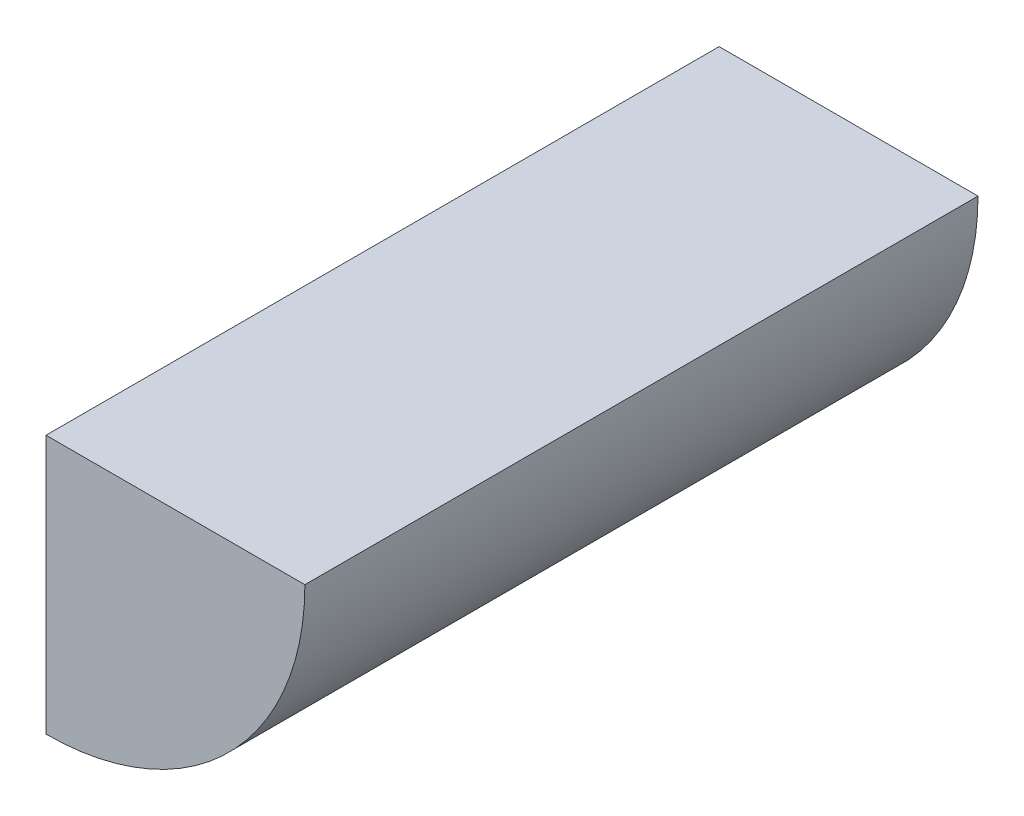
ISO-10303-21;
HEADER;
FILE_DESCRIPTION(('STEP AP214'),'2;1');
FILE_NAME('part.step','',(''),(''),'','','');
FILE_SCHEMA(('AUTOMOTIVE_DESIGN { 1 0 10303 214 1 1 1 1 }'));
ENDSEC;
DATA;
#1=APPLICATION_CONTEXT('core data for automotive mechanical design processes');
#2=APPLICATION_PROTOCOL_DEFINITION('international standard','automotive_design',2000,#1);
#3=PRODUCT_CONTEXT('',#1,'mechanical');
#4=PRODUCT('Part','Part','',(#3));
#5=PRODUCT_RELATED_PRODUCT_CATEGORY('part','',(#4));
#6=PRODUCT_DEFINITION_FORMATION('','',#4);
#7=PRODUCT_DEFINITION_CONTEXT('part definition',#1,'design');
#8=PRODUCT_DEFINITION('design','',#6,#7);
#9=PRODUCT_DEFINITION_SHAPE('','',#8);
#10=(LENGTH_UNIT() NAMED_UNIT(*) SI_UNIT(.MILLI.,.METRE.));
#11=(NAMED_UNIT(*) PLANE_ANGLE_UNIT() SI_UNIT($,.RADIAN.));
#12=(NAMED_UNIT(*) SI_UNIT($,.STERADIAN.) SOLID_ANGLE_UNIT());
#13=UNCERTAINTY_MEASURE_WITH_UNIT(LENGTH_MEASURE(1.E-05),#10,'distance_accuracy_value','');
#14=(GEOMETRIC_REPRESENTATION_CONTEXT(3) GLOBAL_UNCERTAINTY_ASSIGNED_CONTEXT((#13)) GLOBAL_UNIT_ASSIGNED_CONTEXT((#10,
#11,#12)) REPRESENTATION_CONTEXT('',''));
#15=CARTESIAN_POINT('',(0.,0.,0.));
#16=DIRECTION('',(0.,0.,1.));
#17=DIRECTION('',(1.,0.,0.));
#18=AXIS2_PLACEMENT_3D('',#15,#16,#17);
#19=CARTESIAN_POINT('',(0.,19.9590764808235,65.));
#20=DIRECTION('',(0.,-1.,0.));
#21=DIRECTION('',(0.,0.,-1.));
#22=AXIS2_PLACEMENT_3D('',#19,#20,#21);
#23=PLANE('',#22);
#24=DIRECTION('',(-1.,0.,0.));
#25=VECTOR('',#24,1.);
#26=CARTESIAN_POINT('',(0.,19.9590764808235,0.));
#27=LINE('',#26,#25);
#28=CARTESIAN_POINT('',(25.,19.9590764808235,0.));
#29=VERTEX_POINT('',#28);
#30=CARTESIAN_POINT('',(0.,19.9590764808235,0.));
#31=VERTEX_POINT('',#30);
#32=EDGE_CURVE('E79',#29,#31,#27,.T.);
#33=ORIENTED_EDGE('',*,*,#32,.T.);
#34=DIRECTION('',(0.,0.,-1.));
#35=VECTOR('',#34,1.);
#36=CARTESIAN_POINT('',(0.,19.9590764808235,65.));
#37=LINE('',#36,#35);
#38=CARTESIAN_POINT('',(0.,19.9590764808235,65.));
#39=VERTEX_POINT('',#38);
#40=EDGE_CURVE('E11',#39,#31,#37,.T.);
#41=ORIENTED_EDGE('',*,*,#40,.F.);
#42=DIRECTION('',(-1.,0.,0.));
#43=VECTOR('',#42,1.);
#44=CARTESIAN_POINT('',(0.,19.9590764808235,65.));
#45=LINE('',#44,#43);
#46=CARTESIAN_POINT('',(25.,19.9590764808235,65.));
#47=VERTEX_POINT('',#46);
#48=EDGE_CURVE('E72',#47,#39,#45,.T.);
#49=ORIENTED_EDGE('',*,*,#48,.F.);
#50=DIRECTION('',(0.,0.,-1.));
#51=VECTOR('',#50,1.);
#52=CARTESIAN_POINT('',(25.,19.9590764808235,65.));
#53=LINE('',#52,#51);
#54=EDGE_CURVE('E80',#47,#29,#53,.T.);
#55=ORIENTED_EDGE('',*,*,#54,.T.);
#56=EDGE_LOOP('',(#33,#41,#49,#55));
#57=FACE_BOUND('',#56,.T.);
#58=ADVANCED_FACE('F32',(#57),#23,.F.);
#59=CARTESIAN_POINT('',(0.,19.9590764808235,65.));
#60=DIRECTION('',(1.,0.,0.));
#61=DIRECTION('',(0.,1.,0.));
#62=AXIS2_PLACEMENT_3D('',#59,#60,#61);
#63=PLANE('',#62);
#64=DIRECTION('',(0.,-1.,0.));
#65=VECTOR('',#64,1.);
#66=CARTESIAN_POINT('',(0.,19.9590764808235,0.));
#67=LINE('',#66,#65);
#68=CARTESIAN_POINT('',(0.,-5.04092351917653,0.));
#69=VERTEX_POINT('',#68);
#70=EDGE_CURVE('E60',#31,#69,#67,.T.);
#71=ORIENTED_EDGE('',*,*,#70,.T.);
#72=DIRECTION('',(0.,0.,-1.));
#73=VECTOR('',#72,1.);
#74=CARTESIAN_POINT('',(0.,-5.04092351917653,65.));
#75=LINE('',#74,#73);
#76=CARTESIAN_POINT('',(0.,-5.04092351917653,65.));
#77=VERTEX_POINT('',#76);
#78=EDGE_CURVE('E40',#77,#69,#75,.T.);
#79=ORIENTED_EDGE('',*,*,#78,.F.);
#80=DIRECTION('',(0.,-1.,0.));
#81=VECTOR('',#80,1.);
#82=CARTESIAN_POINT('',(0.,19.9590764808235,65.));
#83=LINE('',#82,#81);
#84=EDGE_CURVE('E68',#39,#77,#83,.T.);
#85=ORIENTED_EDGE('',*,*,#84,.F.);
#86=ORIENTED_EDGE('',*,*,#40,.T.);
#87=EDGE_LOOP('',(#71,#79,#85,#86));
#88=FACE_BOUND('',#87,.T.);
#89=ADVANCED_FACE('F69',(#88),#63,.F.);
#90=CARTESIAN_POINT('',(0.,19.9590764808235,65.));
#91=DIRECTION('',(0.,0.,-1.));
#92=DIRECTION('',(-1.,0.,0.));
#93=AXIS2_PLACEMENT_3D('',#90,#91,#92);
#94=CYLINDRICAL_SURFACE('',#93,25.);
#95=CARTESIAN_POINT('',(0.,19.9590764808235,0.));
#96=DIRECTION('',(0.,0.,1.));
#97=DIRECTION('',(-1.,0.,0.));
#98=AXIS2_PLACEMENT_3D('',#95,#96,#97);
#99=CIRCLE('',#98,25.);
#100=EDGE_CURVE('E65',#69,#29,#99,.T.);
#101=ORIENTED_EDGE('',*,*,#100,.T.);
#102=ORIENTED_EDGE('',*,*,#54,.F.);
#103=CARTESIAN_POINT('',(0.,19.9590764808235,65.));
#104=DIRECTION('',(0.,0.,1.));
#105=DIRECTION('',(-1.,0.,0.));
#106=AXIS2_PLACEMENT_3D('',#103,#104,#105);
#107=CIRCLE('',#106,25.);
#108=EDGE_CURVE('E48',#77,#47,#107,.T.);
#109=ORIENTED_EDGE('',*,*,#108,.F.);
#110=ORIENTED_EDGE('',*,*,#78,.T.);
#111=EDGE_LOOP('',(#101,#102,#109,#110));
#112=FACE_BOUND('',#111,.T.);
#113=ADVANCED_FACE('F87',(#112),#94,.T.);
#114=CARTESIAN_POINT('',(0.,19.9590764808235,65.));
#115=DIRECTION('',(0.,0.,-1.));
#116=DIRECTION('',(-1.,0.,0.));
#117=AXIS2_PLACEMENT_3D('',#114,#115,#116);
#118=PLANE('',#117);
#119=ORIENTED_EDGE('',*,*,#48,.T.);
#120=ORIENTED_EDGE('',*,*,#84,.T.);
#121=ORIENTED_EDGE('',*,*,#108,.T.);
#122=EDGE_LOOP('',(#119,#120,#121));
#123=FACE_BOUND('',#122,.T.);
#124=ADVANCED_FACE('F75',(#123),#118,.F.);
#125=CARTESIAN_POINT('',(0.,19.9590764808235,0.));
#126=DIRECTION('',(0.,0.,-1.));
#127=DIRECTION('',(-1.,0.,0.));
#128=AXIS2_PLACEMENT_3D('',#125,#126,#127);
#129=PLANE('',#128);
#130=ORIENTED_EDGE('',*,*,#32,.F.);
#131=ORIENTED_EDGE('',*,*,#100,.F.);
#132=ORIENTED_EDGE('',*,*,#70,.F.);
#133=EDGE_LOOP('',(#130,#131,#132));
#134=FACE_BOUND('',#133,.T.);
#135=ADVANCED_FACE('F88',(#134),#129,.T.);
#136=CLOSED_SHELL('',(#58,#89,#113,#124,#135));
#137=MANIFOLD_SOLID_BREP('B2',#136);
#138=ADVANCED_BREP_SHAPE_REPRESENTATION('',(#18,#137),#14);
#139=SHAPE_DEFINITION_REPRESENTATION(#9,#138);
ENDSEC;
END-ISO-10303-21;
